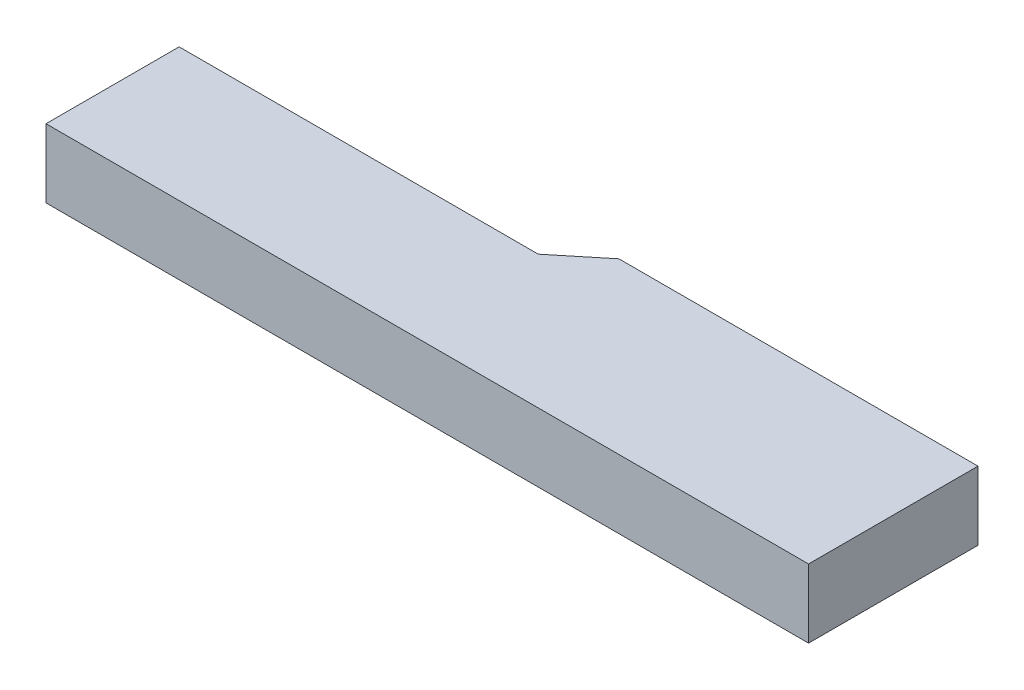
ISO-10303-21;
HEADER;
FILE_DESCRIPTION(('STEP AP214'),'2;1');
FILE_NAME('part.step','',(''),(''),'','','');
FILE_SCHEMA(('AUTOMOTIVE_DESIGN { 1 0 10303 214 1 1 1 1 }'));
ENDSEC;
DATA;
#1=APPLICATION_CONTEXT('core data for automotive mechanical design processes');
#2=APPLICATION_PROTOCOL_DEFINITION('international standard','automotive_design',2000,#1);
#3=PRODUCT_CONTEXT('',#1,'mechanical');
#4=PRODUCT('Part','Part','',(#3));
#5=PRODUCT_RELATED_PRODUCT_CATEGORY('part','',(#4));
#6=PRODUCT_DEFINITION_FORMATION('','',#4);
#7=PRODUCT_DEFINITION_CONTEXT('part definition',#1,'design');
#8=PRODUCT_DEFINITION('design','',#6,#7);
#9=PRODUCT_DEFINITION_SHAPE('','',#8);
#10=(LENGTH_UNIT() NAMED_UNIT(*) SI_UNIT(.MILLI.,.METRE.));
#11=(NAMED_UNIT(*) PLANE_ANGLE_UNIT() SI_UNIT($,.RADIAN.));
#12=(NAMED_UNIT(*) SI_UNIT($,.STERADIAN.) SOLID_ANGLE_UNIT());
#13=UNCERTAINTY_MEASURE_WITH_UNIT(LENGTH_MEASURE(1.E-05),#10,'distance_accuracy_value','');
#14=(GEOMETRIC_REPRESENTATION_CONTEXT(3) GLOBAL_UNCERTAINTY_ASSIGNED_CONTEXT((#13)) GLOBAL_UNIT_ASSIGNED_CONTEXT((#10,
#11,#12)) REPRESENTATION_CONTEXT('',''));
#15=CARTESIAN_POINT('',(0.,0.,0.));
#16=DIRECTION('',(0.,0.,1.));
#17=DIRECTION('',(1.,0.,0.));
#18=AXIS2_PLACEMENT_3D('',#15,#16,#17);
#19=CARTESIAN_POINT('',(-92.3471847207912,17.,-10.992346423112));
#20=DIRECTION('',(1.,0.,0.));
#21=DIRECTION('',(0.,0.,-1.));
#22=AXIS2_PLACEMENT_3D('',#19,#20,#21);
#23=PLANE('',#22);
#24=DIRECTION('',(0.,0.,1.));
#25=VECTOR('',#24,1.);
#26=CARTESIAN_POINT('',(-92.3471847207912,0.,-10.992346423112));
#27=LINE('',#26,#25);
#28=CARTESIAN_POINT('',(-92.3471847207912,0.,-10.992346423112));
#29=VERTEX_POINT('',#28);
#30=CARTESIAN_POINT('',(-92.3471847207912,0.,22.007653576888));
#31=VERTEX_POINT('',#30);
#32=EDGE_CURVE('E118',#29,#31,#27,.T.);
#33=ORIENTED_EDGE('',*,*,#32,.T.);
#34=DIRECTION('',(0.,-1.,0.));
#35=VECTOR('',#34,1.);
#36=CARTESIAN_POINT('',(-92.3471847207912,17.,22.007653576888));
#37=LINE('',#36,#35);
#38=CARTESIAN_POINT('',(-92.3471847207912,17.,22.007653576888));
#39=VERTEX_POINT('',#38);
#40=EDGE_CURVE('E11',#39,#31,#37,.T.);
#41=ORIENTED_EDGE('',*,*,#40,.F.);
#42=DIRECTION('',(0.,0.,1.));
#43=VECTOR('',#42,1.);
#44=CARTESIAN_POINT('',(-92.3471847207912,17.,-10.992346423112));
#45=LINE('',#44,#43);
#46=CARTESIAN_POINT('',(-92.3471847207912,17.,-10.992346423112));
#47=VERTEX_POINT('',#46);
#48=EDGE_CURVE('E130',#47,#39,#45,.T.);
#49=ORIENTED_EDGE('',*,*,#48,.F.);
#50=DIRECTION('',(0.,-1.,0.));
#51=VECTOR('',#50,1.);
#52=CARTESIAN_POINT('',(-92.3471847207912,17.,-10.992346423112));
#53=LINE('',#52,#51);
#54=EDGE_CURVE('E117',#47,#29,#53,.T.);
#55=ORIENTED_EDGE('',*,*,#54,.T.);
#56=EDGE_LOOP('',(#33,#41,#49,#55));
#57=FACE_BOUND('',#56,.T.);
#58=ADVANCED_FACE('F34',(#57),#23,.F.);
#59=CARTESIAN_POINT('',(-92.3471847207912,17.,22.007653576888));
#60=DIRECTION('',(0.,0.,-1.));
#61=DIRECTION('',(-1.,0.,0.));
#62=AXIS2_PLACEMENT_3D('',#59,#60,#61);
#63=PLANE('',#62);
#64=DIRECTION('',(1.,0.,0.));
#65=VECTOR('',#64,1.);
#66=CARTESIAN_POINT('',(-92.3471847207912,0.,22.007653576888));
#67=LINE('',#66,#65);
#68=CARTESIAN_POINT('',(96.6528152792088,0.,22.007653576888));
#69=VERTEX_POINT('',#68);
#70=EDGE_CURVE('E121',#31,#69,#67,.T.);
#71=ORIENTED_EDGE('',*,*,#70,.T.);
#72=DIRECTION('',(0.,-1.,0.));
#73=VECTOR('',#72,1.);
#74=CARTESIAN_POINT('',(96.6528152792088,17.,22.007653576888));
#75=LINE('',#74,#73);
#76=CARTESIAN_POINT('',(96.6528152792088,17.,22.007653576888));
#77=VERTEX_POINT('',#76);
#78=EDGE_CURVE('E42',#77,#69,#75,.T.);
#79=ORIENTED_EDGE('',*,*,#78,.F.);
#80=DIRECTION('',(1.,0.,0.));
#81=VECTOR('',#80,1.);
#82=CARTESIAN_POINT('',(-92.3471847207912,17.,22.007653576888));
#83=LINE('',#82,#81);
#84=EDGE_CURVE('E86',#39,#77,#83,.T.);
#85=ORIENTED_EDGE('',*,*,#84,.F.);
#86=ORIENTED_EDGE('',*,*,#40,.T.);
#87=EDGE_LOOP('',(#71,#79,#85,#86));
#88=FACE_BOUND('',#87,.T.);
#89=ADVANCED_FACE('F136',(#88),#63,.F.);
#90=CARTESIAN_POINT('',(96.6528152792088,17.,-19.992346423112));
#91=DIRECTION('',(1.,0.,0.));
#92=DIRECTION('',(0.,0.,-1.));
#93=AXIS2_PLACEMENT_3D('',#90,#91,#92);
#94=PLANE('',#93);
#95=DIRECTION('',(0.,0.,1.));
#96=VECTOR('',#95,1.);
#97=CARTESIAN_POINT('',(96.6528152792088,0.,-19.992346423112));
#98=LINE('',#97,#96);
#99=CARTESIAN_POINT('',(96.6528152792088,0.,-19.992346423112));
#100=VERTEX_POINT('',#99);
#101=EDGE_CURVE('E124',#100,#69,#98,.T.);
#102=ORIENTED_EDGE('',*,*,#101,.F.);
#103=DIRECTION('',(0.,-1.,0.));
#104=VECTOR('',#103,1.);
#105=CARTESIAN_POINT('',(96.6528152792088,17.,-19.992346423112));
#106=LINE('',#105,#104);
#107=CARTESIAN_POINT('',(96.6528152792088,17.,-19.992346423112));
#108=VERTEX_POINT('',#107);
#109=EDGE_CURVE('E102',#108,#100,#106,.T.);
#110=ORIENTED_EDGE('',*,*,#109,.F.);
#111=DIRECTION('',(0.,0.,1.));
#112=VECTOR('',#111,1.);
#113=CARTESIAN_POINT('',(96.6528152792088,17.,-19.992346423112));
#114=LINE('',#113,#112);
#115=EDGE_CURVE('E111',#108,#77,#114,.T.);
#116=ORIENTED_EDGE('',*,*,#115,.T.);
#117=ORIENTED_EDGE('',*,*,#78,.T.);
#118=EDGE_LOOP('',(#102,#110,#116,#117));
#119=FACE_BOUND('',#118,.T.);
#120=ADVANCED_FACE('F135',(#119),#94,.T.);
#121=CARTESIAN_POINT('',(7.65281527920879,17.,-19.992346423112));
#122=DIRECTION('',(0.,0.,-1.));
#123=DIRECTION('',(-1.,0.,0.));
#124=AXIS2_PLACEMENT_3D('',#121,#122,#123);
#125=PLANE('',#124);
#126=DIRECTION('',(1.,0.,0.));
#127=VECTOR('',#126,1.);
#128=CARTESIAN_POINT('',(7.65281527920879,0.,-19.992346423112));
#129=LINE('',#128,#127);
#130=CARTESIAN_POINT('',(7.65281527920879,0.,-19.992346423112));
#131=VERTEX_POINT('',#130);
#132=EDGE_CURVE('E101',#131,#100,#129,.T.);
#133=ORIENTED_EDGE('',*,*,#132,.F.);
#134=DIRECTION('',(0.,-1.,0.));
#135=VECTOR('',#134,1.);
#136=CARTESIAN_POINT('',(7.65281527920879,17.,-19.992346423112));
#137=LINE('',#136,#135);
#138=CARTESIAN_POINT('',(7.65281527920879,17.,-19.992346423112));
#139=VERTEX_POINT('',#138);
#140=EDGE_CURVE('E95',#139,#131,#137,.T.);
#141=ORIENTED_EDGE('',*,*,#140,.F.);
#142=DIRECTION('',(1.,0.,0.));
#143=VECTOR('',#142,1.);
#144=CARTESIAN_POINT('',(7.65281527920879,17.,-19.992346423112));
#145=LINE('',#144,#143);
#146=EDGE_CURVE('E99',#139,#108,#145,.T.);
#147=ORIENTED_EDGE('',*,*,#146,.T.);
#148=ORIENTED_EDGE('',*,*,#109,.T.);
#149=EDGE_LOOP('',(#133,#141,#147,#148));
#150=FACE_BOUND('',#149,.T.);
#151=ADVANCED_FACE('F97',(#150),#125,.T.);
#152=CARTESIAN_POINT('',(7.65281527920879,17.,-19.992346423112));
#153=DIRECTION('',(0.633237790257262,0.,0.773957299203321));
#154=DIRECTION('',(0.773957299203321,0.,-0.633237790257262));
#155=AXIS2_PLACEMENT_3D('',#152,#153,#154);
#156=PLANE('',#155);
#157=DIRECTION('',(-0.773957299203321,0.,0.633237790257262));
#158=VECTOR('',#157,1.);
#159=CARTESIAN_POINT('',(7.65281527920879,0.,-19.992346423112));
#160=LINE('',#159,#158);
#161=CARTESIAN_POINT('',(-3.34718472079122,0.,-10.992346423112));
#162=VERTEX_POINT('',#161);
#163=EDGE_CURVE('E72',#131,#162,#160,.T.);
#164=ORIENTED_EDGE('',*,*,#163,.T.);
#165=DIRECTION('',(0.,-1.,0.));
#166=VECTOR('',#165,1.);
#167=CARTESIAN_POINT('',(-3.34718472079122,17.,-10.992346423112));
#168=LINE('',#167,#166);
#169=CARTESIAN_POINT('',(-3.34718472079122,17.,-10.992346423112));
#170=VERTEX_POINT('',#169);
#171=EDGE_CURVE('E103',#170,#162,#168,.T.);
#172=ORIENTED_EDGE('',*,*,#171,.F.);
#173=DIRECTION('',(-0.773957299203321,0.,0.633237790257262));
#174=VECTOR('',#173,1.);
#175=CARTESIAN_POINT('',(7.65281527920879,17.,-19.992346423112));
#176=LINE('',#175,#174);
#177=EDGE_CURVE('E105',#139,#170,#176,.T.);
#178=ORIENTED_EDGE('',*,*,#177,.F.);
#179=ORIENTED_EDGE('',*,*,#140,.T.);
#180=EDGE_LOOP('',(#164,#172,#178,#179));
#181=FACE_BOUND('',#180,.T.);
#182=ADVANCED_FACE('F106',(#181),#156,.F.);
#183=CARTESIAN_POINT('',(-3.34718472079122,17.,-10.992346423112));
#184=DIRECTION('',(0.,0.,1.));
#185=DIRECTION('',(1.,0.,0.));
#186=AXIS2_PLACEMENT_3D('',#183,#184,#185);
#187=PLANE('',#186);
#188=DIRECTION('',(-1.,0.,0.));
#189=VECTOR('',#188,1.);
#190=CARTESIAN_POINT('',(-3.34718472079122,0.,-10.992346423112));
#191=LINE('',#190,#189);
#192=EDGE_CURVE('E78',#162,#29,#191,.T.);
#193=ORIENTED_EDGE('',*,*,#192,.T.);
#194=ORIENTED_EDGE('',*,*,#54,.F.);
#195=DIRECTION('',(-1.,0.,0.));
#196=VECTOR('',#195,1.);
#197=CARTESIAN_POINT('',(-3.34718472079122,17.,-10.992346423112));
#198=LINE('',#197,#196);
#199=EDGE_CURVE('E50',#170,#47,#198,.T.);
#200=ORIENTED_EDGE('',*,*,#199,.F.);
#201=ORIENTED_EDGE('',*,*,#171,.T.);
#202=EDGE_LOOP('',(#193,#194,#200,#201));
#203=FACE_BOUND('',#202,.T.);
#204=ADVANCED_FACE('F143',(#203),#187,.F.);
#205=CARTESIAN_POINT('',(0.,17.,0.));
#206=DIRECTION('',(0.,1.,0.));
#207=DIRECTION('',(0.,0.,1.));
#208=AXIS2_PLACEMENT_3D('',#205,#206,#207);
#209=PLANE('',#208);
#210=ORIENTED_EDGE('',*,*,#48,.T.);
#211=ORIENTED_EDGE('',*,*,#84,.T.);
#212=ORIENTED_EDGE('',*,*,#115,.F.);
#213=ORIENTED_EDGE('',*,*,#146,.F.);
#214=ORIENTED_EDGE('',*,*,#177,.T.);
#215=ORIENTED_EDGE('',*,*,#199,.T.);
#216=EDGE_LOOP('',(#210,#211,#212,#213,#214,#215));
#217=FACE_BOUND('',#216,.T.);
#218=ADVANCED_FACE('F109',(#217),#209,.T.);
#219=CARTESIAN_POINT('',(0.,0.,0.));
#220=DIRECTION('',(0.,1.,0.));
#221=DIRECTION('',(0.,0.,1.));
#222=AXIS2_PLACEMENT_3D('',#219,#220,#221);
#223=PLANE('',#222);
#224=ORIENTED_EDGE('',*,*,#32,.F.);
#225=ORIENTED_EDGE('',*,*,#192,.F.);
#226=ORIENTED_EDGE('',*,*,#163,.F.);
#227=ORIENTED_EDGE('',*,*,#132,.T.);
#228=ORIENTED_EDGE('',*,*,#101,.T.);
#229=ORIENTED_EDGE('',*,*,#70,.F.);
#230=EDGE_LOOP('',(#224,#225,#226,#227,#228,#229));
#231=FACE_BOUND('',#230,.T.);
#232=ADVANCED_FACE('F140',(#231),#223,.F.);
#233=CLOSED_SHELL('',(#58,#89,#120,#151,#182,#204,#218,#232));
#234=MANIFOLD_SOLID_BREP('B2',#233);
#235=ADVANCED_BREP_SHAPE_REPRESENTATION('',(#18,#234),#14);
#236=SHAPE_DEFINITION_REPRESENTATION(#9,#235);
ENDSEC;
END-ISO-10303-21;
